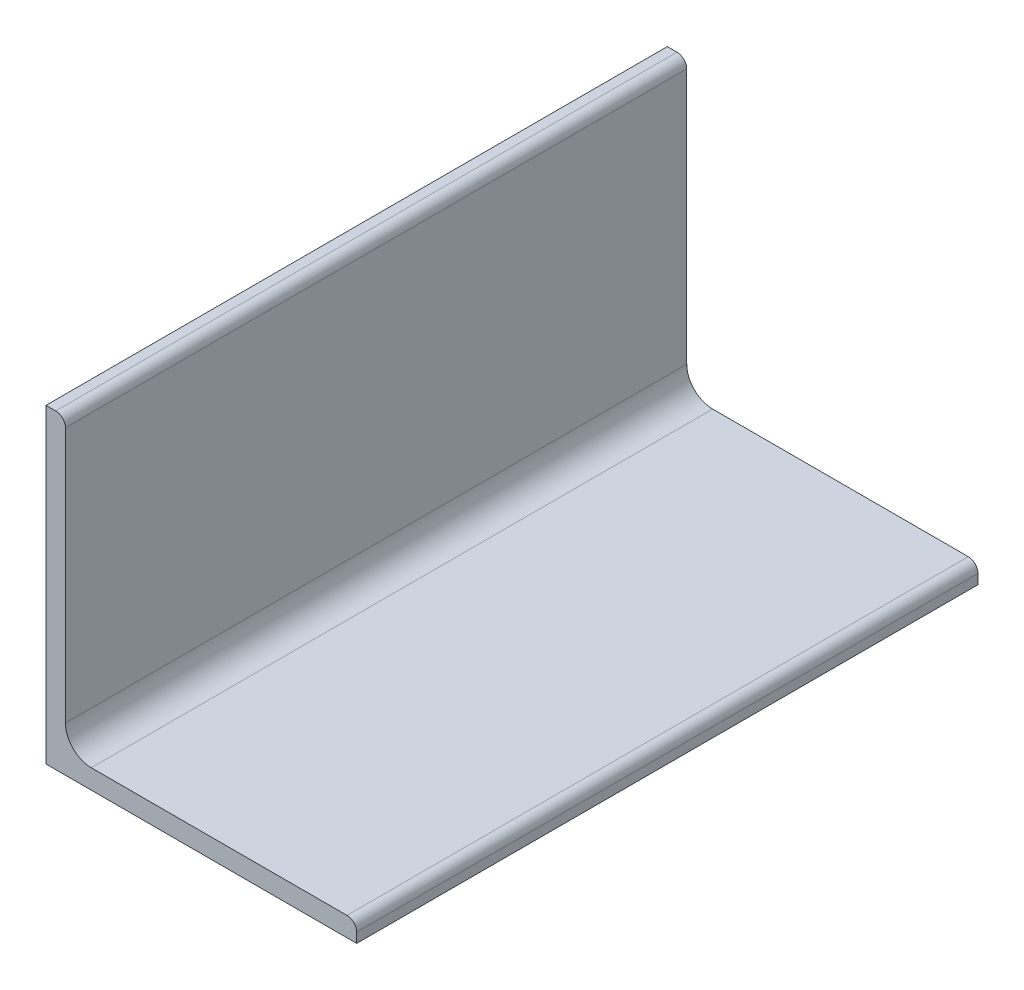
ISO-10303-21;
HEADER;
FILE_DESCRIPTION(('STEP AP214'),'2;1');
FILE_NAME('part.step','',(''),(''),'','','');
FILE_SCHEMA(('AUTOMOTIVE_DESIGN { 1 0 10303 214 1 1 1 1 }'));
ENDSEC;
DATA;
#1=APPLICATION_CONTEXT('core data for automotive mechanical design processes');
#2=APPLICATION_PROTOCOL_DEFINITION('international standard','automotive_design',2000,#1);
#3=PRODUCT_CONTEXT('',#1,'mechanical');
#4=PRODUCT('Part','Part','',(#3));
#5=PRODUCT_RELATED_PRODUCT_CATEGORY('part','',(#4));
#6=PRODUCT_DEFINITION_FORMATION('','',#4);
#7=PRODUCT_DEFINITION_CONTEXT('part definition',#1,'design');
#8=PRODUCT_DEFINITION('design','',#6,#7);
#9=PRODUCT_DEFINITION_SHAPE('','',#8);
#10=(LENGTH_UNIT() NAMED_UNIT(*) SI_UNIT(.MILLI.,.METRE.));
#11=(NAMED_UNIT(*) PLANE_ANGLE_UNIT() SI_UNIT($,.RADIAN.));
#12=(NAMED_UNIT(*) SI_UNIT($,.STERADIAN.) SOLID_ANGLE_UNIT());
#13=UNCERTAINTY_MEASURE_WITH_UNIT(LENGTH_MEASURE(1.E-05),#10,'distance_accuracy_value','');
#14=(GEOMETRIC_REPRESENTATION_CONTEXT(3) GLOBAL_UNCERTAINTY_ASSIGNED_CONTEXT((#13)) GLOBAL_UNIT_ASSIGNED_CONTEXT((#10,
#11,#12)) REPRESENTATION_CONTEXT('',''));
#15=CARTESIAN_POINT('',(0.,0.,0.));
#16=DIRECTION('',(0.,0.,1.));
#17=DIRECTION('',(1.,0.,0.));
#18=AXIS2_PLACEMENT_3D('',#15,#16,#17);
#19=CARTESIAN_POINT('',(0.425014111727251,152.925428131371,304.8));
#20=DIRECTION('',(1.,0.,0.));
#21=DIRECTION('',(0.,0.,-1.));
#22=AXIS2_PLACEMENT_3D('',#19,#20,#21);
#23=PLANE('',#22);
#24=DIRECTION('',(0.,-1.,0.));
#25=VECTOR('',#24,1.);
#26=CARTESIAN_POINT('',(0.425014111727251,152.925428131371,0.));
#27=LINE('',#26,#25);
#28=CARTESIAN_POINT('',(0.425014111727251,152.925428131371,0.));
#29=VERTEX_POINT('',#28);
#30=CARTESIAN_POINT('',(0.425014111727251,0.525428131371291,0.));
#31=VERTEX_POINT('',#30);
#32=EDGE_CURVE('E135',#29,#31,#27,.T.);
#33=ORIENTED_EDGE('',*,*,#32,.T.);
#34=DIRECTION('',(0.,0.,-1.));
#35=VECTOR('',#34,1.);
#36=CARTESIAN_POINT('',(0.425014111727251,0.525428131371291,304.8));
#37=LINE('',#36,#35);
#38=CARTESIAN_POINT('',(0.425014111727251,0.525428131371291,304.8));
#39=VERTEX_POINT('',#38);
#40=EDGE_CURVE('E11',#39,#31,#37,.T.);
#41=ORIENTED_EDGE('',*,*,#40,.F.);
#42=DIRECTION('',(0.,-1.,0.));
#43=VECTOR('',#42,1.);
#44=CARTESIAN_POINT('',(0.425014111727251,152.925428131371,304.8));
#45=LINE('',#44,#43);
#46=CARTESIAN_POINT('',(0.425014111727251,152.925428131371,304.8));
#47=VERTEX_POINT('',#46);
#48=EDGE_CURVE('E151',#47,#39,#45,.T.);
#49=ORIENTED_EDGE('',*,*,#48,.F.);
#50=DIRECTION('',(0.,0.,-1.));
#51=VECTOR('',#50,1.);
#52=CARTESIAN_POINT('',(0.425014111727251,152.925428131371,304.8));
#53=LINE('',#52,#51);
#54=EDGE_CURVE('E131',#47,#29,#53,.T.);
#55=ORIENTED_EDGE('',*,*,#54,.T.);
#56=EDGE_LOOP('',(#33,#41,#49,#55));
#57=FACE_BOUND('',#56,.T.);
#58=ADVANCED_FACE('F33',(#57),#23,.F.);
#59=CARTESIAN_POINT('',(0.425014111727251,0.525428131371291,304.8));
#60=DIRECTION('',(0.,1.,0.));
#61=DIRECTION('',(0.,0.,1.));
#62=AXIS2_PLACEMENT_3D('',#59,#60,#61);
#63=PLANE('',#62);
#64=DIRECTION('',(1.,0.,0.));
#65=VECTOR('',#64,1.);
#66=CARTESIAN_POINT('',(0.425014111727251,0.525428131371291,0.));
#67=LINE('',#66,#65);
#68=CARTESIAN_POINT('',(152.825014111727,0.525428131371291,0.));
#69=VERTEX_POINT('',#68);
#70=EDGE_CURVE('E138',#31,#69,#67,.T.);
#71=ORIENTED_EDGE('',*,*,#70,.T.);
#72=DIRECTION('',(0.,0.,-1.));
#73=VECTOR('',#72,1.);
#74=CARTESIAN_POINT('',(152.825014111727,0.525428131371291,304.8));
#75=LINE('',#74,#73);
#76=CARTESIAN_POINT('',(152.825014111727,0.525428131371291,304.8));
#77=VERTEX_POINT('',#76);
#78=EDGE_CURVE('E41',#77,#69,#75,.T.);
#79=ORIENTED_EDGE('',*,*,#78,.F.);
#80=DIRECTION('',(1.,0.,0.));
#81=VECTOR('',#80,1.);
#82=CARTESIAN_POINT('',(0.425014111727251,0.525428131371291,304.8));
#83=LINE('',#82,#81);
#84=EDGE_CURVE('E95',#39,#77,#83,.T.);
#85=ORIENTED_EDGE('',*,*,#84,.F.);
#86=ORIENTED_EDGE('',*,*,#40,.T.);
#87=EDGE_LOOP('',(#71,#79,#85,#86));
#88=FACE_BOUND('',#87,.T.);
#89=ADVANCED_FACE('F194',(#88),#63,.F.);
#90=CARTESIAN_POINT('',(152.825014111727,0.525428131371291,304.8));
#91=DIRECTION('',(-1.,0.,0.));
#92=DIRECTION('',(0.,0.,1.));
#93=AXIS2_PLACEMENT_3D('',#90,#91,#92);
#94=PLANE('',#93);
#95=DIRECTION('',(0.,1.,0.));
#96=VECTOR('',#95,1.);
#97=CARTESIAN_POINT('',(152.825014111727,0.525428131371291,0.));
#98=LINE('',#97,#96);
#99=CARTESIAN_POINT('',(152.825014111727,5.28792813137129,0.));
#100=VERTEX_POINT('',#99);
#101=EDGE_CURVE('E140',#69,#100,#98,.T.);
#102=ORIENTED_EDGE('',*,*,#101,.T.);
#103=DIRECTION('',(0.,0.,-1.));
#104=VECTOR('',#103,1.);
#105=CARTESIAN_POINT('',(152.825014111727,5.28792813137129,304.8));
#106=LINE('',#105,#104);
#107=CARTESIAN_POINT('',(152.825014111727,5.28792813137129,304.8));
#108=VERTEX_POINT('',#107);
#109=EDGE_CURVE('E161',#108,#100,#106,.T.);
#110=ORIENTED_EDGE('',*,*,#109,.F.);
#111=DIRECTION('',(0.,1.,0.));
#112=VECTOR('',#111,1.);
#113=CARTESIAN_POINT('',(152.825014111727,0.525428131371291,304.8));
#114=LINE('',#113,#112);
#115=EDGE_CURVE('E169',#77,#108,#114,.T.);
#116=ORIENTED_EDGE('',*,*,#115,.F.);
#117=ORIENTED_EDGE('',*,*,#78,.T.);
#118=EDGE_LOOP('',(#102,#110,#116,#117));
#119=FACE_BOUND('',#118,.T.);
#120=ADVANCED_FACE('F167',(#119),#94,.F.);
#121=CARTESIAN_POINT('',(148.062514111727,5.28792813137129,304.8));
#122=DIRECTION('',(0.,0.,-1.));
#123=DIRECTION('',(-1.,0.,0.));
#124=AXIS2_PLACEMENT_3D('',#121,#122,#123);
#125=CYLINDRICAL_SURFACE('',#124,4.7625);
#126=CARTESIAN_POINT('',(148.062514111727,5.28792813137129,0.));
#127=DIRECTION('',(0.,0.,1.));
#128=DIRECTION('',(1.,0.,0.));
#129=AXIS2_PLACEMENT_3D('',#126,#127,#128);
#130=CIRCLE('',#129,4.7625);
#131=CARTESIAN_POINT('',(148.062514111727,10.0504281313713,0.));
#132=VERTEX_POINT('',#131);
#133=EDGE_CURVE('E142',#100,#132,#130,.T.);
#134=ORIENTED_EDGE('',*,*,#133,.T.);
#135=DIRECTION('',(0.,0.,-1.));
#136=VECTOR('',#135,1.);
#137=CARTESIAN_POINT('',(148.062514111727,10.0504281313713,304.8));
#138=LINE('',#137,#136);
#139=CARTESIAN_POINT('',(148.062514111727,10.0504281313713,304.8));
#140=VERTEX_POINT('',#139);
#141=EDGE_CURVE('E158',#140,#132,#138,.T.);
#142=ORIENTED_EDGE('',*,*,#141,.F.);
#143=CARTESIAN_POINT('',(148.062514111727,5.28792813137129,304.8));
#144=DIRECTION('',(0.,0.,1.));
#145=DIRECTION('',(1.,0.,0.));
#146=AXIS2_PLACEMENT_3D('',#143,#144,#145);
#147=CIRCLE('',#146,4.7625);
#148=EDGE_CURVE('E185',#108,#140,#147,.T.);
#149=ORIENTED_EDGE('',*,*,#148,.F.);
#150=ORIENTED_EDGE('',*,*,#109,.T.);
#151=EDGE_LOOP('',(#134,#142,#149,#150));
#152=FACE_BOUND('',#151,.T.);
#153=ADVANCED_FACE('F178',(#152),#125,.T.);
#154=CARTESIAN_POINT('',(148.062514111727,10.0504281313713,304.8));
#155=DIRECTION('',(0.,-1.,0.));
#156=DIRECTION('',(0.,0.,-1.));
#157=AXIS2_PLACEMENT_3D('',#154,#155,#156);
#158=PLANE('',#157);
#159=DIRECTION('',(-1.,0.,0.));
#160=VECTOR('',#159,1.);
#161=CARTESIAN_POINT('',(148.062514111727,10.0504281313713,0.));
#162=LINE('',#161,#160);
#163=CARTESIAN_POINT('',(22.6500141117273,10.0504281313713,0.));
#164=VERTEX_POINT('',#163);
#165=EDGE_CURVE('E144',#132,#164,#162,.T.);
#166=ORIENTED_EDGE('',*,*,#165,.T.);
#167=DIRECTION('',(0.,0.,-1.));
#168=VECTOR('',#167,1.);
#169=CARTESIAN_POINT('',(22.6500141117273,10.0504281313713,304.8));
#170=LINE('',#169,#168);
#171=CARTESIAN_POINT('',(22.6500141117273,10.0504281313713,304.8));
#172=VERTEX_POINT('',#171);
#173=EDGE_CURVE('E155',#172,#164,#170,.T.);
#174=ORIENTED_EDGE('',*,*,#173,.F.);
#175=DIRECTION('',(-1.,0.,0.));
#176=VECTOR('',#175,1.);
#177=CARTESIAN_POINT('',(148.062514111727,10.0504281313713,304.8));
#178=LINE('',#177,#176);
#179=EDGE_CURVE('E184',#140,#172,#178,.T.);
#180=ORIENTED_EDGE('',*,*,#179,.F.);
#181=ORIENTED_EDGE('',*,*,#141,.T.);
#182=EDGE_LOOP('',(#166,#174,#180,#181));
#183=FACE_BOUND('',#182,.T.);
#184=ADVANCED_FACE('F182',(#183),#158,.F.);
#185=CARTESIAN_POINT('',(22.6500141117272,22.7504281313713,304.8));
#186=DIRECTION('',(0.,0.,-1.));
#187=DIRECTION('',(-1.,0.,0.));
#188=AXIS2_PLACEMENT_3D('',#185,#186,#187);
#189=CYLINDRICAL_SURFACE('',#188,12.7);
#190=CARTESIAN_POINT('',(22.6500141117272,22.7504281313713,0.));
#191=DIRECTION('',(0.,0.,-1.));
#192=DIRECTION('',(1.,0.,0.));
#193=AXIS2_PLACEMENT_3D('',#190,#191,#192);
#194=CIRCLE('',#193,12.7);
#195=CARTESIAN_POINT('',(9.95001411172725,22.7504281313713,0.));
#196=VERTEX_POINT('',#195);
#197=EDGE_CURVE('E146',#164,#196,#194,.T.);
#198=ORIENTED_EDGE('',*,*,#197,.T.);
#199=DIRECTION('',(0.,0.,-1.));
#200=VECTOR('',#199,1.);
#201=CARTESIAN_POINT('',(9.95001411172725,22.7504281313713,304.8));
#202=LINE('',#201,#200);
#203=CARTESIAN_POINT('',(9.95001411172725,22.7504281313713,304.8));
#204=VERTEX_POINT('',#203);
#205=EDGE_CURVE('E126',#204,#196,#202,.T.);
#206=ORIENTED_EDGE('',*,*,#205,.F.);
#207=CARTESIAN_POINT('',(22.6500141117272,22.7504281313713,304.8));
#208=DIRECTION('',(0.,0.,-1.));
#209=DIRECTION('',(1.,0.,0.));
#210=AXIS2_PLACEMENT_3D('',#207,#208,#209);
#211=CIRCLE('',#210,12.7);
#212=EDGE_CURVE('E117',#172,#204,#211,.T.);
#213=ORIENTED_EDGE('',*,*,#212,.F.);
#214=ORIENTED_EDGE('',*,*,#173,.T.);
#215=EDGE_LOOP('',(#198,#206,#213,#214));
#216=FACE_BOUND('',#215,.T.);
#217=ADVANCED_FACE('F206',(#216),#189,.F.);
#218=CARTESIAN_POINT('',(9.95001411172725,22.7504281313713,304.8));
#219=DIRECTION('',(-1.,0.,0.));
#220=DIRECTION('',(0.,0.,1.));
#221=AXIS2_PLACEMENT_3D('',#218,#219,#220);
#222=PLANE('',#221);
#223=DIRECTION('',(0.,1.,0.));
#224=VECTOR('',#223,1.);
#225=CARTESIAN_POINT('',(9.95001411172725,22.7504281313713,0.));
#226=LINE('',#225,#224);
#227=CARTESIAN_POINT('',(9.95001411172725,148.162928131371,0.));
#228=VERTEX_POINT('',#227);
#229=EDGE_CURVE('E125',#196,#228,#226,.T.);
#230=ORIENTED_EDGE('',*,*,#229,.T.);
#231=DIRECTION('',(0.,0.,-1.));
#232=VECTOR('',#231,1.);
#233=CARTESIAN_POINT('',(9.95001411172725,148.162928131371,304.8));
#234=LINE('',#233,#232);
#235=CARTESIAN_POINT('',(9.95001411172725,148.162928131371,304.8));
#236=VERTEX_POINT('',#235);
#237=EDGE_CURVE('E122',#236,#228,#234,.T.);
#238=ORIENTED_EDGE('',*,*,#237,.F.);
#239=DIRECTION('',(0.,1.,0.));
#240=VECTOR('',#239,1.);
#241=CARTESIAN_POINT('',(9.95001411172725,22.7504281313713,304.8));
#242=LINE('',#241,#240);
#243=EDGE_CURVE('E111',#204,#236,#242,.T.);
#244=ORIENTED_EDGE('',*,*,#243,.F.);
#245=ORIENTED_EDGE('',*,*,#205,.T.);
#246=EDGE_LOOP('',(#230,#238,#244,#245));
#247=FACE_BOUND('',#246,.T.);
#248=ADVANCED_FACE('F123',(#247),#222,.F.);
#249=CARTESIAN_POINT('',(5.18751411172725,148.162928131371,304.8));
#250=DIRECTION('',(0.,0.,-1.));
#251=DIRECTION('',(-1.,0.,0.));
#252=AXIS2_PLACEMENT_3D('',#249,#250,#251);
#253=CYLINDRICAL_SURFACE('',#252,4.7625);
#254=CARTESIAN_POINT('',(5.18751411172725,148.162928131371,0.));
#255=DIRECTION('',(0.,0.,1.));
#256=DIRECTION('',(1.,0.,0.));
#257=AXIS2_PLACEMENT_3D('',#254,#255,#256);
#258=CIRCLE('',#257,4.7625);
#259=CARTESIAN_POINT('',(5.18751411172725,152.925428131371,0.));
#260=VERTEX_POINT('',#259);
#261=EDGE_CURVE('E81',#228,#260,#258,.T.);
#262=ORIENTED_EDGE('',*,*,#261,.T.);
#263=DIRECTION('',(0.,0.,-1.));
#264=VECTOR('',#263,1.);
#265=CARTESIAN_POINT('',(5.18751411172725,152.925428131371,304.8));
#266=LINE('',#265,#264);
#267=CARTESIAN_POINT('',(5.18751411172725,152.925428131371,304.8));
#268=VERTEX_POINT('',#267);
#269=EDGE_CURVE('E127',#268,#260,#266,.T.);
#270=ORIENTED_EDGE('',*,*,#269,.F.);
#271=CARTESIAN_POINT('',(5.18751411172725,148.162928131371,304.8));
#272=DIRECTION('',(0.,0.,1.));
#273=DIRECTION('',(1.,0.,0.));
#274=AXIS2_PLACEMENT_3D('',#271,#272,#273);
#275=CIRCLE('',#274,4.7625);
#276=EDGE_CURVE('E115',#236,#268,#275,.T.);
#277=ORIENTED_EDGE('',*,*,#276,.F.);
#278=ORIENTED_EDGE('',*,*,#237,.T.);
#279=EDGE_LOOP('',(#262,#270,#277,#278));
#280=FACE_BOUND('',#279,.T.);
#281=ADVANCED_FACE('F129',(#280),#253,.T.);
#282=CARTESIAN_POINT('',(5.18751411172725,152.925428131371,304.8));
#283=DIRECTION('',(0.,-1.,0.));
#284=DIRECTION('',(0.,0.,-1.));
#285=AXIS2_PLACEMENT_3D('',#282,#283,#284);
#286=PLANE('',#285);
#287=DIRECTION('',(-1.,0.,0.));
#288=VECTOR('',#287,1.);
#289=CARTESIAN_POINT('',(5.18751411172725,152.925428131371,0.));
#290=LINE('',#289,#288);
#291=EDGE_CURVE('E87',#260,#29,#290,.T.);
#292=ORIENTED_EDGE('',*,*,#291,.T.);
#293=ORIENTED_EDGE('',*,*,#54,.F.);
#294=DIRECTION('',(-1.,0.,0.));
#295=VECTOR('',#294,1.);
#296=CARTESIAN_POINT('',(5.18751411172725,152.925428131371,304.8));
#297=LINE('',#296,#295);
#298=EDGE_CURVE('E49',#268,#47,#297,.T.);
#299=ORIENTED_EDGE('',*,*,#298,.F.);
#300=ORIENTED_EDGE('',*,*,#269,.T.);
#301=EDGE_LOOP('',(#292,#293,#299,#300));
#302=FACE_BOUND('',#301,.T.);
#303=ADVANCED_FACE('F214',(#302),#286,.F.);
#304=CARTESIAN_POINT('',(148.062514111727,5.28792813137129,304.8));
#305=DIRECTION('',(0.,0.,1.));
#306=DIRECTION('',(1.,0.,0.));
#307=AXIS2_PLACEMENT_3D('',#304,#305,#306);
#308=PLANE('',#307);
#309=ORIENTED_EDGE('',*,*,#48,.T.);
#310=ORIENTED_EDGE('',*,*,#84,.T.);
#311=ORIENTED_EDGE('',*,*,#115,.T.);
#312=ORIENTED_EDGE('',*,*,#148,.T.);
#313=ORIENTED_EDGE('',*,*,#179,.T.);
#314=ORIENTED_EDGE('',*,*,#212,.T.);
#315=ORIENTED_EDGE('',*,*,#243,.T.);
#316=ORIENTED_EDGE('',*,*,#276,.T.);
#317=ORIENTED_EDGE('',*,*,#298,.T.);
#318=EDGE_LOOP('',(#309,#310,#311,#312,#313,#314,#315,#316,#317));
#319=FACE_BOUND('',#318,.T.);
#320=ADVANCED_FACE('F113',(#319),#308,.T.);
#321=CARTESIAN_POINT('',(148.062514111727,5.28792813137129,0.));
#322=DIRECTION('',(0.,0.,1.));
#323=DIRECTION('',(1.,0.,0.));
#324=AXIS2_PLACEMENT_3D('',#321,#322,#323);
#325=PLANE('',#324);
#326=ORIENTED_EDGE('',*,*,#32,.F.);
#327=ORIENTED_EDGE('',*,*,#291,.F.);
#328=ORIENTED_EDGE('',*,*,#261,.F.);
#329=ORIENTED_EDGE('',*,*,#229,.F.);
#330=ORIENTED_EDGE('',*,*,#197,.F.);
#331=ORIENTED_EDGE('',*,*,#165,.F.);
#332=ORIENTED_EDGE('',*,*,#133,.F.);
#333=ORIENTED_EDGE('',*,*,#101,.F.);
#334=ORIENTED_EDGE('',*,*,#70,.F.);
#335=EDGE_LOOP('',(#326,#327,#328,#329,#330,#331,#332,#333,#334));
#336=FACE_BOUND('',#335,.T.);
#337=ADVANCED_FACE('F173',(#336),#325,.F.);
#338=CLOSED_SHELL('',(#58,#89,#120,#153,#184,#217,#248,#281,#303,#320,#337));
#339=MANIFOLD_SOLID_BREP('B2',#338);
#340=ADVANCED_BREP_SHAPE_REPRESENTATION('',(#18,#339),#14);
#341=SHAPE_DEFINITION_REPRESENTATION(#9,#340);
ENDSEC;
END-ISO-10303-21;
